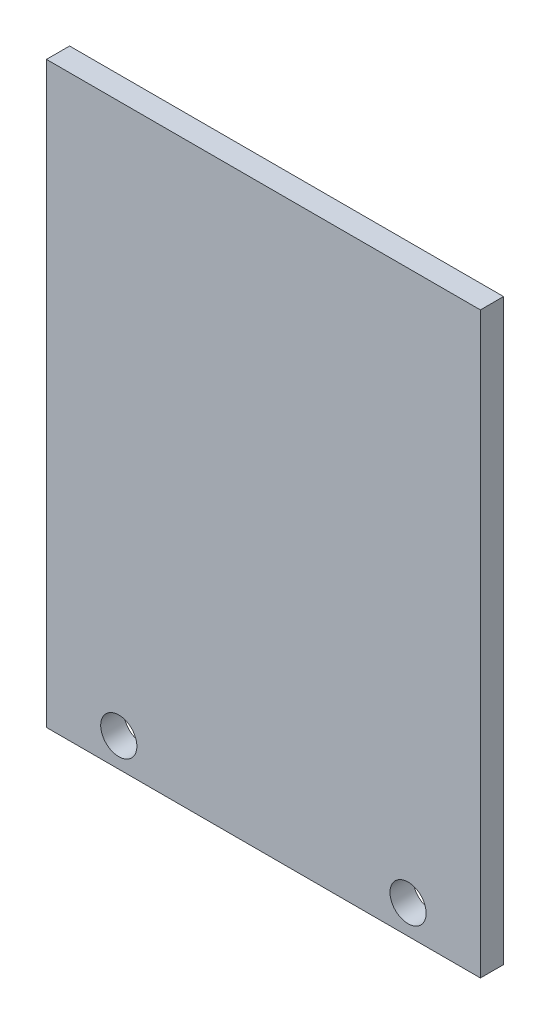
ISO-10303-21;
HEADER;
FILE_DESCRIPTION(('STEP AP214'),'2;1');
FILE_NAME('part.step','',(''),(''),'','','');
FILE_SCHEMA(('AUTOMOTIVE_DESIGN { 1 0 10303 214 1 1 1 1 }'));
ENDSEC;
DATA;
#1=APPLICATION_CONTEXT('core data for automotive mechanical design processes');
#2=APPLICATION_PROTOCOL_DEFINITION('international standard','automotive_design',2000,#1);
#3=PRODUCT_CONTEXT('',#1,'mechanical');
#4=PRODUCT('Part','Part','',(#3));
#5=PRODUCT_RELATED_PRODUCT_CATEGORY('part','',(#4));
#6=PRODUCT_DEFINITION_FORMATION('','',#4);
#7=PRODUCT_DEFINITION_CONTEXT('part definition',#1,'design');
#8=PRODUCT_DEFINITION('design','',#6,#7);
#9=PRODUCT_DEFINITION_SHAPE('','',#8);
#10=(LENGTH_UNIT() NAMED_UNIT(*) SI_UNIT(.MILLI.,.METRE.));
#11=(NAMED_UNIT(*) PLANE_ANGLE_UNIT() SI_UNIT($,.RADIAN.));
#12=(NAMED_UNIT(*) SI_UNIT($,.STERADIAN.) SOLID_ANGLE_UNIT());
#13=UNCERTAINTY_MEASURE_WITH_UNIT(LENGTH_MEASURE(1.E-05),#10,'distance_accuracy_value','');
#14=(GEOMETRIC_REPRESENTATION_CONTEXT(3) GLOBAL_UNCERTAINTY_ASSIGNED_CONTEXT((#13)) GLOBAL_UNIT_ASSIGNED_CONTEXT((#10,
#11,#12)) REPRESENTATION_CONTEXT('',''));
#15=CARTESIAN_POINT('',(0.,0.,0.));
#16=DIRECTION('',(0.,0.,1.));
#17=DIRECTION('',(1.,0.,0.));
#18=AXIS2_PLACEMENT_3D('',#15,#16,#17);
#19=CARTESIAN_POINT('',(0.,0.,1.6));
#20=DIRECTION('',(0.,0.,-1.));
#21=DIRECTION('',(-1.,0.,0.));
#22=AXIS2_PLACEMENT_3D('',#19,#20,#21);
#23=PLANE('',#22);
#24=DIRECTION('',(0.,1.,0.));
#25=VECTOR('',#24,1.);
#26=CARTESIAN_POINT('',(15.,-20.,1.6));
#27=LINE('',#26,#25);
#28=CARTESIAN_POINT('',(15.,-20.,1.6));
#29=VERTEX_POINT('',#28);
#30=CARTESIAN_POINT('',(15.,20.,1.6));
#31=VERTEX_POINT('',#30);
#32=EDGE_CURVE('E87',#29,#31,#27,.T.);
#33=ORIENTED_EDGE('',*,*,#32,.T.);
#34=DIRECTION('',(-1.,0.,0.));
#35=VECTOR('',#34,1.);
#36=CARTESIAN_POINT('',(-15.,20.,1.6));
#37=LINE('',#36,#35);
#38=CARTESIAN_POINT('',(-15.,20.,1.6));
#39=VERTEX_POINT('',#38);
#40=EDGE_CURVE('E82',#31,#39,#37,.T.);
#41=ORIENTED_EDGE('',*,*,#40,.T.);
#42=DIRECTION('',(0.,-1.,0.));
#43=VECTOR('',#42,1.);
#44=CARTESIAN_POINT('',(-15.,-20.,1.6));
#45=LINE('',#44,#43);
#46=CARTESIAN_POINT('',(-15.,-20.,1.6));
#47=VERTEX_POINT('',#46);
#48=EDGE_CURVE('E85',#39,#47,#45,.T.);
#49=ORIENTED_EDGE('',*,*,#48,.T.);
#50=DIRECTION('',(1.,0.,0.));
#51=VECTOR('',#50,1.);
#52=CARTESIAN_POINT('',(-15.,-20.,1.6));
#53=LINE('',#52,#51);
#54=EDGE_CURVE('E52',#47,#29,#53,.T.);
#55=ORIENTED_EDGE('',*,*,#54,.T.);
#56=EDGE_LOOP('',(#33,#41,#49,#55));
#57=FACE_BOUND('',#56,.T.);
#58=CARTESIAN_POINT('',(-10.,-18.,1.6));
#59=DIRECTION('',(0.,0.,1.));
#60=DIRECTION('',(1.,0.,0.));
#61=AXIS2_PLACEMENT_3D('',#58,#59,#60);
#62=CIRCLE('',#61,1.25);
#63=CARTESIAN_POINT('',(-8.75,-18.,1.6));
#64=VERTEX_POINT('',#63);
#65=EDGE_CURVE('E102',#64,#64,#62,.T.);
#66=ORIENTED_EDGE('',*,*,#65,.F.);
#67=EDGE_LOOP('',(#66));
#68=FACE_BOUND('',#67,.T.);
#69=CARTESIAN_POINT('',(10.,-18.,1.6));
#70=DIRECTION('',(0.,0.,1.));
#71=DIRECTION('',(1.,0.,0.));
#72=AXIS2_PLACEMENT_3D('',#69,#70,#71);
#73=CIRCLE('',#72,1.25);
#74=CARTESIAN_POINT('',(11.25,-18.,1.6));
#75=VERTEX_POINT('',#74);
#76=EDGE_CURVE('E117',#75,#75,#73,.T.);
#77=ORIENTED_EDGE('',*,*,#76,.F.);
#78=EDGE_LOOP('',(#77));
#79=FACE_BOUND('',#78,.T.);
#80=ADVANCED_FACE('F35',(#57,#68,#79),#23,.F.);
#81=CARTESIAN_POINT('',(0.,0.,0.));
#82=DIRECTION('',(0.,0.,-1.));
#83=DIRECTION('',(-1.,0.,0.));
#84=AXIS2_PLACEMENT_3D('',#81,#82,#83);
#85=PLANE('',#84);
#86=CARTESIAN_POINT('',(-10.,-18.,0.));
#87=DIRECTION('',(0.,0.,1.));
#88=DIRECTION('',(1.,0.,0.));
#89=AXIS2_PLACEMENT_3D('',#86,#87,#88);
#90=CIRCLE('',#89,1.25);
#91=CARTESIAN_POINT('',(-8.75,-18.,0.));
#92=VERTEX_POINT('',#91);
#93=EDGE_CURVE('E114',#92,#92,#90,.T.);
#94=ORIENTED_EDGE('',*,*,#93,.T.);
#95=EDGE_LOOP('',(#94));
#96=FACE_BOUND('',#95,.T.);
#97=DIRECTION('',(0.,1.,0.));
#98=VECTOR('',#97,1.);
#99=CARTESIAN_POINT('',(15.,-20.,0.));
#100=LINE('',#99,#98);
#101=CARTESIAN_POINT('',(15.,-20.,0.));
#102=VERTEX_POINT('',#101);
#103=CARTESIAN_POINT('',(15.,20.,0.));
#104=VERTEX_POINT('',#103);
#105=EDGE_CURVE('E99',#102,#104,#100,.T.);
#106=ORIENTED_EDGE('',*,*,#105,.F.);
#107=DIRECTION('',(1.,0.,0.));
#108=VECTOR('',#107,1.);
#109=CARTESIAN_POINT('',(-15.,-20.,0.));
#110=LINE('',#109,#108);
#111=CARTESIAN_POINT('',(-15.,-20.,0.));
#112=VERTEX_POINT('',#111);
#113=EDGE_CURVE('E75',#112,#102,#110,.T.);
#114=ORIENTED_EDGE('',*,*,#113,.F.);
#115=DIRECTION('',(0.,-1.,0.));
#116=VECTOR('',#115,1.);
#117=CARTESIAN_POINT('',(-15.,-20.,0.));
#118=LINE('',#117,#116);
#119=CARTESIAN_POINT('',(-15.,20.,0.));
#120=VERTEX_POINT('',#119);
#121=EDGE_CURVE('E69',#120,#112,#118,.T.);
#122=ORIENTED_EDGE('',*,*,#121,.F.);
#123=DIRECTION('',(-1.,0.,0.));
#124=VECTOR('',#123,1.);
#125=CARTESIAN_POINT('',(-15.,20.,0.));
#126=LINE('',#125,#124);
#127=EDGE_CURVE('E91',#104,#120,#126,.T.);
#128=ORIENTED_EDGE('',*,*,#127,.F.);
#129=EDGE_LOOP('',(#106,#114,#122,#128));
#130=FACE_BOUND('',#129,.T.);
#131=CARTESIAN_POINT('',(10.,-18.,0.));
#132=DIRECTION('',(0.,0.,1.));
#133=DIRECTION('',(1.,0.,0.));
#134=AXIS2_PLACEMENT_3D('',#131,#132,#133);
#135=CIRCLE('',#134,1.25);
#136=CARTESIAN_POINT('',(11.25,-18.,0.));
#137=VERTEX_POINT('',#136);
#138=EDGE_CURVE('E120',#137,#137,#135,.T.);
#139=ORIENTED_EDGE('',*,*,#138,.T.);
#140=EDGE_LOOP('',(#139));
#141=FACE_BOUND('',#140,.T.);
#142=ADVANCED_FACE('F110',(#96,#130,#141),#85,.T.);
#143=CARTESIAN_POINT('',(15.,-20.,1.6));
#144=DIRECTION('',(-1.,0.,0.));
#145=DIRECTION('',(0.,0.,1.));
#146=AXIS2_PLACEMENT_3D('',#143,#144,#145);
#147=PLANE('',#146);
#148=ORIENTED_EDGE('',*,*,#105,.T.);
#149=DIRECTION('',(0.,0.,-1.));
#150=VECTOR('',#149,1.);
#151=CARTESIAN_POINT('',(15.,20.,1.6));
#152=LINE('',#151,#150);
#153=EDGE_CURVE('E11',#31,#104,#152,.T.);
#154=ORIENTED_EDGE('',*,*,#153,.F.);
#155=ORIENTED_EDGE('',*,*,#32,.F.);
#156=DIRECTION('',(0.,0.,-1.));
#157=VECTOR('',#156,1.);
#158=CARTESIAN_POINT('',(15.,-20.,1.6));
#159=LINE('',#158,#157);
#160=EDGE_CURVE('E95',#29,#102,#159,.T.);
#161=ORIENTED_EDGE('',*,*,#160,.T.);
#162=EDGE_LOOP('',(#148,#154,#155,#161));
#163=FACE_BOUND('',#162,.T.);
#164=ADVANCED_FACE('F37',(#163),#147,.F.);
#165=CARTESIAN_POINT('',(-15.,20.,1.6));
#166=DIRECTION('',(0.,-1.,0.));
#167=DIRECTION('',(0.,0.,-1.));
#168=AXIS2_PLACEMENT_3D('',#165,#166,#167);
#169=PLANE('',#168);
#170=ORIENTED_EDGE('',*,*,#127,.T.);
#171=DIRECTION('',(0.,0.,-1.));
#172=VECTOR('',#171,1.);
#173=CARTESIAN_POINT('',(-15.,20.,1.6));
#174=LINE('',#173,#172);
#175=EDGE_CURVE('E44',#39,#120,#174,.T.);
#176=ORIENTED_EDGE('',*,*,#175,.F.);
#177=ORIENTED_EDGE('',*,*,#40,.F.);
#178=ORIENTED_EDGE('',*,*,#153,.T.);
#179=EDGE_LOOP('',(#170,#176,#177,#178));
#180=FACE_BOUND('',#179,.T.);
#181=ADVANCED_FACE('F90',(#180),#169,.F.);
#182=CARTESIAN_POINT('',(-15.,-20.,1.6));
#183=DIRECTION('',(1.,0.,0.));
#184=DIRECTION('',(0.,0.,-1.));
#185=AXIS2_PLACEMENT_3D('',#182,#183,#184);
#186=PLANE('',#185);
#187=ORIENTED_EDGE('',*,*,#121,.T.);
#188=DIRECTION('',(0.,0.,-1.));
#189=VECTOR('',#188,1.);
#190=CARTESIAN_POINT('',(-15.,-20.,1.6));
#191=LINE('',#190,#189);
#192=EDGE_CURVE('E92',#47,#112,#191,.T.);
#193=ORIENTED_EDGE('',*,*,#192,.F.);
#194=ORIENTED_EDGE('',*,*,#48,.F.);
#195=ORIENTED_EDGE('',*,*,#175,.T.);
#196=EDGE_LOOP('',(#187,#193,#194,#195));
#197=FACE_BOUND('',#196,.T.);
#198=ADVANCED_FACE('F93',(#197),#186,.F.);
#199=CARTESIAN_POINT('',(-15.,-20.,1.6));
#200=DIRECTION('',(0.,1.,0.));
#201=DIRECTION('',(0.,0.,1.));
#202=AXIS2_PLACEMENT_3D('',#199,#200,#201);
#203=PLANE('',#202);
#204=ORIENTED_EDGE('',*,*,#113,.T.);
#205=ORIENTED_EDGE('',*,*,#160,.F.);
#206=ORIENTED_EDGE('',*,*,#54,.F.);
#207=ORIENTED_EDGE('',*,*,#192,.T.);
#208=EDGE_LOOP('',(#204,#205,#206,#207));
#209=FACE_BOUND('',#208,.T.);
#210=ADVANCED_FACE('F107',(#209),#203,.F.);
#211=CARTESIAN_POINT('',(-10.,-18.,1.6));
#212=DIRECTION('',(0.,0.,-1.));
#213=DIRECTION('',(-1.,0.,0.));
#214=AXIS2_PLACEMENT_3D('',#211,#212,#213);
#215=CYLINDRICAL_SURFACE('',#214,1.25);
#216=ORIENTED_EDGE('',*,*,#65,.T.);
#217=EDGE_LOOP('',(#216));
#218=FACE_BOUND('',#217,.T.);
#219=ORIENTED_EDGE('',*,*,#93,.F.);
#220=EDGE_LOOP('',(#219));
#221=FACE_BOUND('',#220,.T.);
#222=ADVANCED_FACE('F137',(#218,#221),#215,.F.);
#223=CARTESIAN_POINT('',(10.,-18.,1.6));
#224=DIRECTION('',(0.,0.,-1.));
#225=DIRECTION('',(-1.,0.,0.));
#226=AXIS2_PLACEMENT_3D('',#223,#224,#225);
#227=CYLINDRICAL_SURFACE('',#226,1.25);
#228=ORIENTED_EDGE('',*,*,#76,.T.);
#229=EDGE_LOOP('',(#228));
#230=FACE_BOUND('',#229,.T.);
#231=ORIENTED_EDGE('',*,*,#138,.F.);
#232=EDGE_LOOP('',(#231));
#233=FACE_BOUND('',#232,.T.);
#234=ADVANCED_FACE('F126',(#230,#233),#227,.F.);
#235=CLOSED_SHELL('',(#80,#142,#164,#181,#198,#210,#222,#234));
#236=MANIFOLD_SOLID_BREP('B2',#235);
#237=ADVANCED_BREP_SHAPE_REPRESENTATION('',(#18,#236),#14);
#238=SHAPE_DEFINITION_REPRESENTATION(#9,#237);
ENDSEC;
END-ISO-10303-21;
